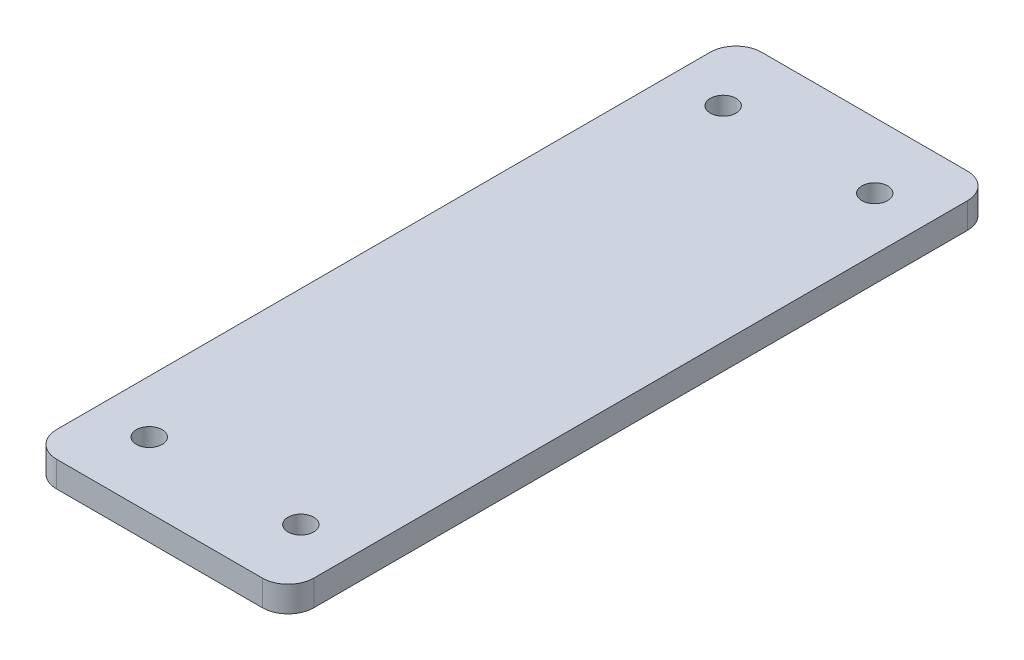
ISO-10303-21;
HEADER;
FILE_DESCRIPTION(('STEP AP214'),'2;1');
FILE_NAME('part.step','',(''),(''),'','','');
FILE_SCHEMA(('AUTOMOTIVE_DESIGN { 1 0 10303 214 1 1 1 1 }'));
ENDSEC;
DATA;
#1=APPLICATION_CONTEXT('core data for automotive mechanical design processes');
#2=APPLICATION_PROTOCOL_DEFINITION('international standard','automotive_design',2000,#1);
#3=PRODUCT_CONTEXT('',#1,'mechanical');
#4=PRODUCT('Part','Part','',(#3));
#5=PRODUCT_RELATED_PRODUCT_CATEGORY('part','',(#4));
#6=PRODUCT_DEFINITION_FORMATION('','',#4);
#7=PRODUCT_DEFINITION_CONTEXT('part definition',#1,'design');
#8=PRODUCT_DEFINITION('design','',#6,#7);
#9=PRODUCT_DEFINITION_SHAPE('','',#8);
#10=(LENGTH_UNIT() NAMED_UNIT(*) SI_UNIT(.MILLI.,.METRE.));
#11=(NAMED_UNIT(*) PLANE_ANGLE_UNIT() SI_UNIT($,.RADIAN.));
#12=(NAMED_UNIT(*) SI_UNIT($,.STERADIAN.) SOLID_ANGLE_UNIT());
#13=UNCERTAINTY_MEASURE_WITH_UNIT(LENGTH_MEASURE(1.E-05),#10,'distance_accuracy_value','');
#14=(GEOMETRIC_REPRESENTATION_CONTEXT(3) GLOBAL_UNCERTAINTY_ASSIGNED_CONTEXT((#13)) GLOBAL_UNIT_ASSIGNED_CONTEXT((#10,
#11,#12)) REPRESENTATION_CONTEXT('',''));
#15=CARTESIAN_POINT('',(0.,0.,0.));
#16=DIRECTION('',(0.,0.,1.));
#17=DIRECTION('',(1.,0.,0.));
#18=AXIS2_PLACEMENT_3D('',#15,#16,#17);
#19=CARTESIAN_POINT('',(12.,3.,38.10801646815));
#20=DIRECTION('',(0.,-1.,0.));
#21=DIRECTION('',(0.,0.,-1.));
#22=AXIS2_PLACEMENT_3D('',#19,#20,#21);
#23=PLANE('',#22);
#24=CARTESIAN_POINT('',(12.,3.,38.10801646815));
#25=DIRECTION('',(0.,1.,0.));
#26=DIRECTION('',(0.,0.,-1.));
#27=AXIS2_PLACEMENT_3D('',#24,#25,#26);
#28=CIRCLE('',#27,3.);
#29=CARTESIAN_POINT('',(12.,3.,41.10801646815));
#30=VERTEX_POINT('',#29);
#31=CARTESIAN_POINT('',(15.,3.,38.1080164681499));
#32=VERTEX_POINT('',#31);
#33=EDGE_CURVE('E144',#30,#32,#28,.T.);
#34=ORIENTED_EDGE('',*,*,#33,.T.);
#35=DIRECTION('',(0.,0.,-1.));
#36=VECTOR('',#35,1.);
#37=CARTESIAN_POINT('',(15.,3.,38.1080164681499));
#38=LINE('',#37,#36);
#39=CARTESIAN_POINT('',(15.,3.,-38.1080164681499));
#40=VERTEX_POINT('',#39);
#41=EDGE_CURVE('E92',#32,#40,#38,.T.);
#42=ORIENTED_EDGE('',*,*,#41,.T.);
#43=CARTESIAN_POINT('',(12.,3.,-38.10801646815));
#44=DIRECTION('',(0.,1.,0.));
#45=DIRECTION('',(0.,0.,1.));
#46=AXIS2_PLACEMENT_3D('',#43,#44,#45);
#47=CIRCLE('',#46,3.);
#48=CARTESIAN_POINT('',(12.,3.,-41.10801646815));
#49=VERTEX_POINT('',#48);
#50=EDGE_CURVE('E159',#40,#49,#47,.T.);
#51=ORIENTED_EDGE('',*,*,#50,.T.);
#52=DIRECTION('',(-1.,0.,0.));
#53=VECTOR('',#52,1.);
#54=CARTESIAN_POINT('',(-12.,3.,-41.10801646815));
#55=LINE('',#54,#53);
#56=CARTESIAN_POINT('',(-12.,3.,-41.10801646815));
#57=VERTEX_POINT('',#56);
#58=EDGE_CURVE('E172',#49,#57,#55,.T.);
#59=ORIENTED_EDGE('',*,*,#58,.T.);
#60=CARTESIAN_POINT('',(-12.,3.,-38.10801646815));
#61=DIRECTION('',(0.,1.,0.));
#62=DIRECTION('',(0.,0.,1.));
#63=AXIS2_PLACEMENT_3D('',#60,#61,#62);
#64=CIRCLE('',#63,3.);
#65=CARTESIAN_POINT('',(-15.,3.,-38.1080164681499));
#66=VERTEX_POINT('',#65);
#67=EDGE_CURVE('E111',#57,#66,#64,.T.);
#68=ORIENTED_EDGE('',*,*,#67,.T.);
#69=DIRECTION('',(0.,0.,1.));
#70=VECTOR('',#69,1.);
#71=CARTESIAN_POINT('',(-15.,3.,38.1080164681499));
#72=LINE('',#71,#70);
#73=CARTESIAN_POINT('',(-15.,3.,38.1080164681499));
#74=VERTEX_POINT('',#73);
#75=EDGE_CURVE('E105',#66,#74,#72,.T.);
#76=ORIENTED_EDGE('',*,*,#75,.T.);
#77=CARTESIAN_POINT('',(-12.,3.,38.10801646815));
#78=DIRECTION('',(0.,1.,0.));
#79=DIRECTION('',(0.,0.,-1.));
#80=AXIS2_PLACEMENT_3D('',#77,#78,#79);
#81=CIRCLE('',#80,3.);
#82=CARTESIAN_POINT('',(-12.,3.,41.10801646815));
#83=VERTEX_POINT('',#82);
#84=EDGE_CURVE('E109',#74,#83,#81,.T.);
#85=ORIENTED_EDGE('',*,*,#84,.T.);
#86=DIRECTION('',(1.,0.,0.));
#87=VECTOR('',#86,1.);
#88=CARTESIAN_POINT('',(-12.,3.,41.10801646815));
#89=LINE('',#88,#87);
#90=EDGE_CURVE('E49',#83,#30,#89,.T.);
#91=ORIENTED_EDGE('',*,*,#90,.T.);
#92=EDGE_LOOP('',(#34,#42,#51,#59,#68,#76,#85,#91));
#93=FACE_BOUND('',#92,.T.);
#94=CARTESIAN_POINT('',(-8.83883476483185,3.,-33.4627924380176));
#95=DIRECTION('',(0.,1.,0.));
#96=DIRECTION('',(0.,0.,1.));
#97=AXIS2_PLACEMENT_3D('',#94,#95,#96);
#98=CIRCLE('',#97,1.5);
#99=CARTESIAN_POINT('',(-8.83883476483185,3.,-31.9627924380176));
#100=VERTEX_POINT('',#99);
#101=EDGE_CURVE('E133',#100,#100,#98,.T.);
#102=ORIENTED_EDGE('',*,*,#101,.F.);
#103=EDGE_LOOP('',(#102));
#104=FACE_BOUND('',#103,.T.);
#105=CARTESIAN_POINT('',(8.83883476483185,3.,-33.4627924380176));
#106=DIRECTION('',(0.,1.,0.));
#107=DIRECTION('',(0.,0.,-1.));
#108=AXIS2_PLACEMENT_3D('',#105,#106,#107);
#109=CIRCLE('',#108,1.5);
#110=CARTESIAN_POINT('',(8.83883476483185,3.,-34.9627924380176));
#111=VERTEX_POINT('',#110);
#112=EDGE_CURVE('E181',#111,#111,#109,.T.);
#113=ORIENTED_EDGE('',*,*,#112,.F.);
#114=EDGE_LOOP('',(#113));
#115=FACE_BOUND('',#114,.T.);
#116=CARTESIAN_POINT('',(8.83883476483185,3.,33.4627924380176));
#117=DIRECTION('',(0.,1.,0.));
#118=DIRECTION('',(0.,0.,1.));
#119=AXIS2_PLACEMENT_3D('',#116,#117,#118);
#120=CIRCLE('',#119,1.5);
#121=CARTESIAN_POINT('',(8.83883476483185,3.,34.9627924380176));
#122=VERTEX_POINT('',#121);
#123=EDGE_CURVE('E187',#122,#122,#120,.T.);
#124=ORIENTED_EDGE('',*,*,#123,.F.);
#125=EDGE_LOOP('',(#124));
#126=FACE_BOUND('',#125,.T.);
#127=CARTESIAN_POINT('',(-8.83883476483185,3.,33.4627924380176));
#128=DIRECTION('',(0.,1.,0.));
#129=DIRECTION('',(0.,0.,-1.));
#130=AXIS2_PLACEMENT_3D('',#127,#128,#129);
#131=CIRCLE('',#130,1.5);
#132=CARTESIAN_POINT('',(-8.83883476483185,3.,31.9627924380176));
#133=VERTEX_POINT('',#132);
#134=EDGE_CURVE('E193',#133,#133,#131,.T.);
#135=ORIENTED_EDGE('',*,*,#134,.F.);
#136=EDGE_LOOP('',(#135));
#137=FACE_BOUND('',#136,.T.);
#138=ADVANCED_FACE('F32',(#93,#104,#115,#126,#137),#23,.F.);
#139=CARTESIAN_POINT('',(12.,0.,38.10801646815));
#140=DIRECTION('',(0.,-1.,0.));
#141=DIRECTION('',(0.,0.,-1.));
#142=AXIS2_PLACEMENT_3D('',#139,#140,#141);
#143=PLANE('',#142);
#144=CARTESIAN_POINT('',(8.83883476483185,0.,33.4627924380176));
#145=DIRECTION('',(0.,1.,0.));
#146=DIRECTION('',(0.,0.,1.));
#147=AXIS2_PLACEMENT_3D('',#144,#145,#146);
#148=CIRCLE('',#147,1.5);
#149=CARTESIAN_POINT('',(8.83883476483185,0.,34.9627924380176));
#150=VERTEX_POINT('',#149);
#151=EDGE_CURVE('E190',#150,#150,#148,.T.);
#152=ORIENTED_EDGE('',*,*,#151,.T.);
#153=EDGE_LOOP('',(#152));
#154=FACE_BOUND('',#153,.T.);
#155=CARTESIAN_POINT('',(-8.83883476483185,0.,-33.4627924380176));
#156=DIRECTION('',(0.,1.,0.));
#157=DIRECTION('',(0.,0.,1.));
#158=AXIS2_PLACEMENT_3D('',#155,#156,#157);
#159=CIRCLE('',#158,1.5);
#160=CARTESIAN_POINT('',(-8.83883476483185,0.,-31.9627924380176));
#161=VERTEX_POINT('',#160);
#162=EDGE_CURVE('E178',#161,#161,#159,.T.);
#163=ORIENTED_EDGE('',*,*,#162,.T.);
#164=EDGE_LOOP('',(#163));
#165=FACE_BOUND('',#164,.T.);
#166=CARTESIAN_POINT('',(12.,0.,38.10801646815));
#167=DIRECTION('',(0.,1.,0.));
#168=DIRECTION('',(0.,0.,-1.));
#169=AXIS2_PLACEMENT_3D('',#166,#167,#168);
#170=CIRCLE('',#169,3.);
#171=CARTESIAN_POINT('',(12.,0.,41.10801646815));
#172=VERTEX_POINT('',#171);
#173=CARTESIAN_POINT('',(15.,0.,38.1080164681499));
#174=VERTEX_POINT('',#173);
#175=EDGE_CURVE('E129',#172,#174,#170,.T.);
#176=ORIENTED_EDGE('',*,*,#175,.F.);
#177=DIRECTION('',(1.,0.,0.));
#178=VECTOR('',#177,1.);
#179=CARTESIAN_POINT('',(-12.,0.,41.10801646815));
#180=LINE('',#179,#178);
#181=CARTESIAN_POINT('',(-12.,0.,41.10801646815));
#182=VERTEX_POINT('',#181);
#183=EDGE_CURVE('E84',#182,#172,#180,.T.);
#184=ORIENTED_EDGE('',*,*,#183,.F.);
#185=CARTESIAN_POINT('',(-12.,0.,38.10801646815));
#186=DIRECTION('',(0.,1.,0.));
#187=DIRECTION('',(0.,0.,-1.));
#188=AXIS2_PLACEMENT_3D('',#185,#186,#187);
#189=CIRCLE('',#188,3.);
#190=CARTESIAN_POINT('',(-15.,0.,38.1080164681499));
#191=VERTEX_POINT('',#190);
#192=EDGE_CURVE('E78',#191,#182,#189,.T.);
#193=ORIENTED_EDGE('',*,*,#192,.F.);
#194=DIRECTION('',(0.,0.,1.));
#195=VECTOR('',#194,1.);
#196=CARTESIAN_POINT('',(-15.,0.,38.1080164681499));
#197=LINE('',#196,#195);
#198=CARTESIAN_POINT('',(-15.,0.,-38.1080164681499));
#199=VERTEX_POINT('',#198);
#200=EDGE_CURVE('E119',#199,#191,#197,.T.);
#201=ORIENTED_EDGE('',*,*,#200,.F.);
#202=CARTESIAN_POINT('',(-12.,0.,-38.10801646815));
#203=DIRECTION('',(0.,1.,0.));
#204=DIRECTION('',(0.,0.,1.));
#205=AXIS2_PLACEMENT_3D('',#202,#203,#204);
#206=CIRCLE('',#205,3.);
#207=CARTESIAN_POINT('',(-12.,0.,-41.10801646815));
#208=VERTEX_POINT('',#207);
#209=EDGE_CURVE('E139',#208,#199,#206,.T.);
#210=ORIENTED_EDGE('',*,*,#209,.F.);
#211=DIRECTION('',(-1.,0.,0.));
#212=VECTOR('',#211,1.);
#213=CARTESIAN_POINT('',(-12.,0.,-41.10801646815));
#214=LINE('',#213,#212);
#215=CARTESIAN_POINT('',(12.,0.,-41.10801646815));
#216=VERTEX_POINT('',#215);
#217=EDGE_CURVE('E137',#216,#208,#214,.T.);
#218=ORIENTED_EDGE('',*,*,#217,.F.);
#219=CARTESIAN_POINT('',(12.,0.,-38.10801646815));
#220=DIRECTION('',(0.,1.,0.));
#221=DIRECTION('',(0.,0.,1.));
#222=AXIS2_PLACEMENT_3D('',#219,#220,#221);
#223=CIRCLE('',#222,3.);
#224=CARTESIAN_POINT('',(15.,0.,-38.1080164681499));
#225=VERTEX_POINT('',#224);
#226=EDGE_CURVE('E135',#225,#216,#223,.T.);
#227=ORIENTED_EDGE('',*,*,#226,.F.);
#228=DIRECTION('',(0.,0.,-1.));
#229=VECTOR('',#228,1.);
#230=CARTESIAN_POINT('',(15.,0.,38.1080164681499));
#231=LINE('',#230,#229);
#232=EDGE_CURVE('E132',#174,#225,#231,.T.);
#233=ORIENTED_EDGE('',*,*,#232,.F.);
#234=EDGE_LOOP('',(#176,#184,#193,#201,#210,#218,#227,#233));
#235=FACE_BOUND('',#234,.T.);
#236=CARTESIAN_POINT('',(8.83883476483185,0.,-33.4627924380176));
#237=DIRECTION('',(0.,1.,0.));
#238=DIRECTION('',(0.,0.,-1.));
#239=AXIS2_PLACEMENT_3D('',#236,#237,#238);
#240=CIRCLE('',#239,1.5);
#241=CARTESIAN_POINT('',(8.83883476483185,0.,-34.9627924380176));
#242=VERTEX_POINT('',#241);
#243=EDGE_CURVE('E184',#242,#242,#240,.T.);
#244=ORIENTED_EDGE('',*,*,#243,.T.);
#245=EDGE_LOOP('',(#244));
#246=FACE_BOUND('',#245,.T.);
#247=CARTESIAN_POINT('',(-8.83883476483185,0.,33.4627924380176));
#248=DIRECTION('',(0.,1.,0.));
#249=DIRECTION('',(0.,0.,-1.));
#250=AXIS2_PLACEMENT_3D('',#247,#248,#249);
#251=CIRCLE('',#250,1.5);
#252=CARTESIAN_POINT('',(-8.83883476483185,0.,31.9627924380176));
#253=VERTEX_POINT('',#252);
#254=EDGE_CURVE('E196',#253,#253,#251,.T.);
#255=ORIENTED_EDGE('',*,*,#254,.T.);
#256=EDGE_LOOP('',(#255));
#257=FACE_BOUND('',#256,.T.);
#258=ADVANCED_FACE('F163',(#154,#165,#235,#246,#257),#143,.T.);
#259=CARTESIAN_POINT('',(12.,3.,38.10801646815));
#260=DIRECTION('',(0.,-1.,0.));
#261=DIRECTION('',(0.,0.,-1.));
#262=AXIS2_PLACEMENT_3D('',#259,#260,#261);
#263=CYLINDRICAL_SURFACE('',#262,3.);
#264=ORIENTED_EDGE('',*,*,#175,.T.);
#265=DIRECTION('',(0.,-1.,0.));
#266=VECTOR('',#265,1.);
#267=CARTESIAN_POINT('',(15.,3.,38.1080164681499));
#268=LINE('',#267,#266);
#269=EDGE_CURVE('E11',#32,#174,#268,.T.);
#270=ORIENTED_EDGE('',*,*,#269,.F.);
#271=ORIENTED_EDGE('',*,*,#33,.F.);
#272=DIRECTION('',(0.,-1.,0.));
#273=VECTOR('',#272,1.);
#274=CARTESIAN_POINT('',(12.,3.,41.10801646815));
#275=LINE('',#274,#273);
#276=EDGE_CURVE('E125',#30,#172,#275,.T.);
#277=ORIENTED_EDGE('',*,*,#276,.T.);
#278=EDGE_LOOP('',(#264,#270,#271,#277));
#279=FACE_BOUND('',#278,.T.);
#280=ADVANCED_FACE('F34',(#279),#263,.T.);
#281=CARTESIAN_POINT('',(15.,3.,38.1080164681499));
#282=DIRECTION('',(-1.,0.,0.));
#283=DIRECTION('',(0.,0.,1.));
#284=AXIS2_PLACEMENT_3D('',#281,#282,#283);
#285=PLANE('',#284);
#286=ORIENTED_EDGE('',*,*,#232,.T.);
#287=DIRECTION('',(0.,-1.,0.));
#288=VECTOR('',#287,1.);
#289=CARTESIAN_POINT('',(15.,3.,-38.1080164681499));
#290=LINE('',#289,#288);
#291=EDGE_CURVE('E41',#40,#225,#290,.T.);
#292=ORIENTED_EDGE('',*,*,#291,.F.);
#293=ORIENTED_EDGE('',*,*,#41,.F.);
#294=ORIENTED_EDGE('',*,*,#269,.T.);
#295=EDGE_LOOP('',(#286,#292,#293,#294));
#296=FACE_BOUND('',#295,.T.);
#297=ADVANCED_FACE('F228',(#296),#285,.F.);
#298=CARTESIAN_POINT('',(12.,3.,-38.10801646815));
#299=DIRECTION('',(0.,-1.,0.));
#300=DIRECTION('',(0.,0.,-1.));
#301=AXIS2_PLACEMENT_3D('',#298,#299,#300);
#302=CYLINDRICAL_SURFACE('',#301,3.);
#303=ORIENTED_EDGE('',*,*,#226,.T.);
#304=DIRECTION('',(0.,-1.,0.));
#305=VECTOR('',#304,1.);
#306=CARTESIAN_POINT('',(12.,3.,-41.10801646815));
#307=LINE('',#306,#305);
#308=EDGE_CURVE('E151',#49,#216,#307,.T.);
#309=ORIENTED_EDGE('',*,*,#308,.F.);
#310=ORIENTED_EDGE('',*,*,#50,.F.);
#311=ORIENTED_EDGE('',*,*,#291,.T.);
#312=EDGE_LOOP('',(#303,#309,#310,#311));
#313=FACE_BOUND('',#312,.T.);
#314=ADVANCED_FACE('F157',(#313),#302,.T.);
#315=CARTESIAN_POINT('',(-12.,3.,-41.10801646815));
#316=DIRECTION('',(0.,0.,1.));
#317=DIRECTION('',(1.,0.,0.));
#318=AXIS2_PLACEMENT_3D('',#315,#316,#317);
#319=PLANE('',#318);
#320=ORIENTED_EDGE('',*,*,#217,.T.);
#321=DIRECTION('',(0.,-1.,0.));
#322=VECTOR('',#321,1.);
#323=CARTESIAN_POINT('',(-12.,3.,-41.10801646815));
#324=LINE('',#323,#322);
#325=EDGE_CURVE('E148',#57,#208,#324,.T.);
#326=ORIENTED_EDGE('',*,*,#325,.F.);
#327=ORIENTED_EDGE('',*,*,#58,.F.);
#328=ORIENTED_EDGE('',*,*,#308,.T.);
#329=EDGE_LOOP('',(#320,#326,#327,#328));
#330=FACE_BOUND('',#329,.T.);
#331=ADVANCED_FACE('F168',(#330),#319,.F.);
#332=CARTESIAN_POINT('',(-12.,3.,-38.10801646815));
#333=DIRECTION('',(0.,-1.,0.));
#334=DIRECTION('',(0.,0.,-1.));
#335=AXIS2_PLACEMENT_3D('',#332,#333,#334);
#336=CYLINDRICAL_SURFACE('',#335,3.);
#337=ORIENTED_EDGE('',*,*,#209,.T.);
#338=DIRECTION('',(0.,-1.,0.));
#339=VECTOR('',#338,1.);
#340=CARTESIAN_POINT('',(-15.,3.,-38.1080164681499));
#341=LINE('',#340,#339);
#342=EDGE_CURVE('E120',#66,#199,#341,.T.);
#343=ORIENTED_EDGE('',*,*,#342,.F.);
#344=ORIENTED_EDGE('',*,*,#67,.F.);
#345=ORIENTED_EDGE('',*,*,#325,.T.);
#346=EDGE_LOOP('',(#337,#343,#344,#345));
#347=FACE_BOUND('',#346,.T.);
#348=ADVANCED_FACE('F171',(#347),#336,.T.);
#349=CARTESIAN_POINT('',(-15.,3.,38.1080164681499));
#350=DIRECTION('',(1.,0.,0.));
#351=DIRECTION('',(0.,0.,-1.));
#352=AXIS2_PLACEMENT_3D('',#349,#350,#351);
#353=PLANE('',#352);
#354=ORIENTED_EDGE('',*,*,#200,.T.);
#355=DIRECTION('',(0.,-1.,0.));
#356=VECTOR('',#355,1.);
#357=CARTESIAN_POINT('',(-15.,3.,38.1080164681499));
#358=LINE('',#357,#356);
#359=EDGE_CURVE('E116',#74,#191,#358,.T.);
#360=ORIENTED_EDGE('',*,*,#359,.F.);
#361=ORIENTED_EDGE('',*,*,#75,.F.);
#362=ORIENTED_EDGE('',*,*,#342,.T.);
#363=EDGE_LOOP('',(#354,#360,#361,#362));
#364=FACE_BOUND('',#363,.T.);
#365=ADVANCED_FACE('F117',(#364),#353,.F.);
#366=CARTESIAN_POINT('',(-12.,3.,38.10801646815));
#367=DIRECTION('',(0.,-1.,0.));
#368=DIRECTION('',(0.,0.,-1.));
#369=AXIS2_PLACEMENT_3D('',#366,#367,#368);
#370=CYLINDRICAL_SURFACE('',#369,3.);
#371=ORIENTED_EDGE('',*,*,#192,.T.);
#372=DIRECTION('',(0.,-1.,0.));
#373=VECTOR('',#372,1.);
#374=CARTESIAN_POINT('',(-12.,3.,41.10801646815));
#375=LINE('',#374,#373);
#376=EDGE_CURVE('E121',#83,#182,#375,.T.);
#377=ORIENTED_EDGE('',*,*,#376,.F.);
#378=ORIENTED_EDGE('',*,*,#84,.F.);
#379=ORIENTED_EDGE('',*,*,#359,.T.);
#380=EDGE_LOOP('',(#371,#377,#378,#379));
#381=FACE_BOUND('',#380,.T.);
#382=ADVANCED_FACE('F123',(#381),#370,.T.);
#383=CARTESIAN_POINT('',(-12.,3.,41.10801646815));
#384=DIRECTION('',(0.,0.,-1.));
#385=DIRECTION('',(-1.,0.,0.));
#386=AXIS2_PLACEMENT_3D('',#383,#384,#385);
#387=PLANE('',#386);
#388=ORIENTED_EDGE('',*,*,#183,.T.);
#389=ORIENTED_EDGE('',*,*,#276,.F.);
#390=ORIENTED_EDGE('',*,*,#90,.F.);
#391=ORIENTED_EDGE('',*,*,#376,.T.);
#392=EDGE_LOOP('',(#388,#389,#390,#391));
#393=FACE_BOUND('',#392,.T.);
#394=ADVANCED_FACE('F216',(#393),#387,.F.);
#395=CARTESIAN_POINT('',(-8.83883476483185,3.,-33.4627924380176));
#396=DIRECTION('',(0.,-1.,0.));
#397=DIRECTION('',(0.,0.,-1.));
#398=AXIS2_PLACEMENT_3D('',#395,#396,#397);
#399=CYLINDRICAL_SURFACE('',#398,1.5);
#400=ORIENTED_EDGE('',*,*,#101,.T.);
#401=EDGE_LOOP('',(#400));
#402=FACE_BOUND('',#401,.T.);
#403=ORIENTED_EDGE('',*,*,#162,.F.);
#404=EDGE_LOOP('',(#403));
#405=FACE_BOUND('',#404,.T.);
#406=ADVANCED_FACE('F213',(#402,#405),#399,.F.);
#407=CARTESIAN_POINT('',(8.83883476483185,3.,-33.4627924380176));
#408=DIRECTION('',(0.,-1.,0.));
#409=DIRECTION('',(0.,0.,-1.));
#410=AXIS2_PLACEMENT_3D('',#407,#408,#409);
#411=CYLINDRICAL_SURFACE('',#410,1.5);
#412=ORIENTED_EDGE('',*,*,#112,.T.);
#413=EDGE_LOOP('',(#412));
#414=FACE_BOUND('',#413,.T.);
#415=ORIENTED_EDGE('',*,*,#243,.F.);
#416=EDGE_LOOP('',(#415));
#417=FACE_BOUND('',#416,.T.);
#418=ADVANCED_FACE('F292',(#414,#417),#411,.F.);
#419=CARTESIAN_POINT('',(8.83883476483185,3.,33.4627924380176));
#420=DIRECTION('',(0.,-1.,0.));
#421=DIRECTION('',(0.,0.,-1.));
#422=AXIS2_PLACEMENT_3D('',#419,#420,#421);
#423=CYLINDRICAL_SURFACE('',#422,1.5);
#424=ORIENTED_EDGE('',*,*,#123,.T.);
#425=EDGE_LOOP('',(#424));
#426=FACE_BOUND('',#425,.T.);
#427=ORIENTED_EDGE('',*,*,#151,.F.);
#428=EDGE_LOOP('',(#427));
#429=FACE_BOUND('',#428,.T.);
#430=ADVANCED_FACE('F300',(#426,#429),#423,.F.);
#431=CARTESIAN_POINT('',(-8.83883476483185,3.,33.4627924380176));
#432=DIRECTION('',(0.,-1.,0.));
#433=DIRECTION('',(0.,0.,-1.));
#434=AXIS2_PLACEMENT_3D('',#431,#432,#433);
#435=CYLINDRICAL_SURFACE('',#434,1.5);
#436=ORIENTED_EDGE('',*,*,#134,.T.);
#437=EDGE_LOOP('',(#436));
#438=FACE_BOUND('',#437,.T.);
#439=ORIENTED_EDGE('',*,*,#254,.F.);
#440=EDGE_LOOP('',(#439));
#441=FACE_BOUND('',#440,.T.);
#442=ADVANCED_FACE('F202',(#438,#441),#435,.F.);
#443=CLOSED_SHELL('',(#138,#258,#280,#297,#314,#331,#348,#365,#382,#394,#406,#418,#430,#442));
#444=MANIFOLD_SOLID_BREP('B2',#443);
#445=ADVANCED_BREP_SHAPE_REPRESENTATION('',(#18,#444),#14);
#446=SHAPE_DEFINITION_REPRESENTATION(#9,#445);
ENDSEC;
END-ISO-10303-21;
